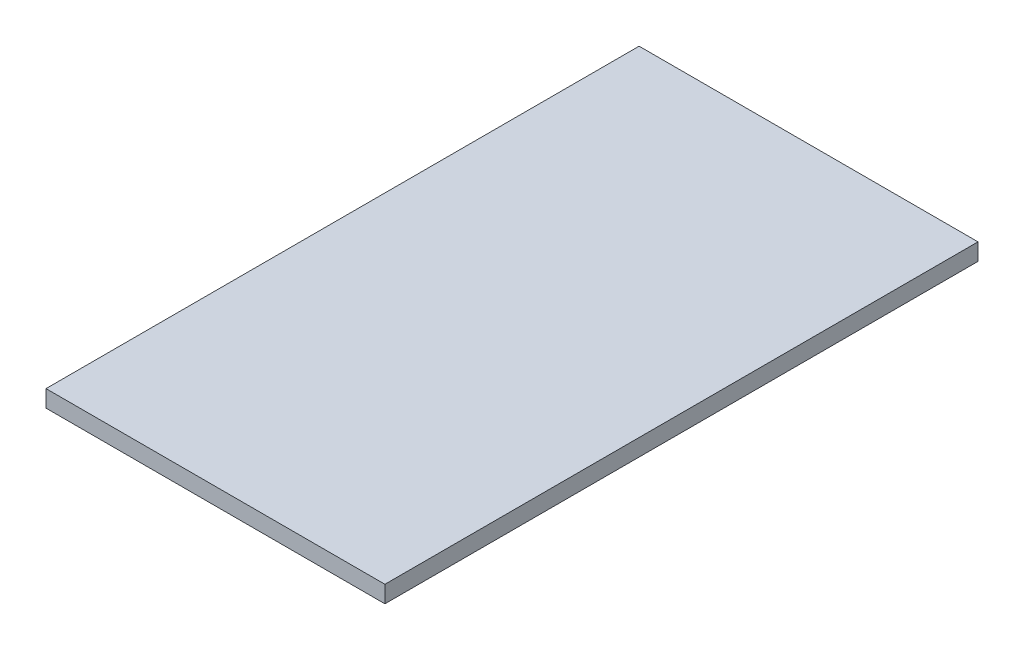
ISO-10303-21;
HEADER;
FILE_DESCRIPTION(('STEP AP214'),'2;1');
FILE_NAME('part.step','',(''),(''),'','','');
FILE_SCHEMA(('AUTOMOTIVE_DESIGN { 1 0 10303 214 1 1 1 1 }'));
ENDSEC;
DATA;
#1=APPLICATION_CONTEXT('core data for automotive mechanical design processes');
#2=APPLICATION_PROTOCOL_DEFINITION('international standard','automotive_design',2000,#1);
#3=PRODUCT_CONTEXT('',#1,'mechanical');
#4=PRODUCT('Part','Part','',(#3));
#5=PRODUCT_RELATED_PRODUCT_CATEGORY('part','',(#4));
#6=PRODUCT_DEFINITION_FORMATION('','',#4);
#7=PRODUCT_DEFINITION_CONTEXT('part definition',#1,'design');
#8=PRODUCT_DEFINITION('design','',#6,#7);
#9=PRODUCT_DEFINITION_SHAPE('','',#8);
#10=(LENGTH_UNIT() NAMED_UNIT(*) SI_UNIT(.MILLI.,.METRE.));
#11=(NAMED_UNIT(*) PLANE_ANGLE_UNIT() SI_UNIT($,.RADIAN.));
#12=(NAMED_UNIT(*) SI_UNIT($,.STERADIAN.) SOLID_ANGLE_UNIT());
#13=UNCERTAINTY_MEASURE_WITH_UNIT(LENGTH_MEASURE(1.E-05),#10,'distance_accuracy_value','');
#14=(GEOMETRIC_REPRESENTATION_CONTEXT(3) GLOBAL_UNCERTAINTY_ASSIGNED_CONTEXT((#13)) GLOBAL_UNIT_ASSIGNED_CONTEXT((#10,
#11,#12)) REPRESENTATION_CONTEXT('',''));
#15=CARTESIAN_POINT('',(0.,0.,0.));
#16=DIRECTION('',(0.,0.,1.));
#17=DIRECTION('',(1.,0.,0.));
#18=AXIS2_PLACEMENT_3D('',#15,#16,#17);
#19=CARTESIAN_POINT('',(0.,10.,0.));
#20=DIRECTION('',(1.,0.,0.));
#21=DIRECTION('',(0.,0.,-1.));
#22=AXIS2_PLACEMENT_3D('',#19,#20,#21);
#23=PLANE('',#22);
#24=DIRECTION('',(0.,0.,1.));
#25=VECTOR('',#24,1.);
#26=CARTESIAN_POINT('',(0.,0.,0.));
#27=LINE('',#26,#25);
#28=CARTESIAN_POINT('',(0.,0.,-350.));
#29=VERTEX_POINT('',#28);
#30=CARTESIAN_POINT('',(0.,0.,0.));
#31=VERTEX_POINT('',#30);
#32=EDGE_CURVE('E98',#29,#31,#27,.T.);
#33=ORIENTED_EDGE('',*,*,#32,.T.);
#34=DIRECTION('',(0.,-1.,0.));
#35=VECTOR('',#34,1.);
#36=CARTESIAN_POINT('',(0.,10.,0.));
#37=LINE('',#36,#35);
#38=CARTESIAN_POINT('',(0.,10.,0.));
#39=VERTEX_POINT('',#38);
#40=EDGE_CURVE('E11',#39,#31,#37,.T.);
#41=ORIENTED_EDGE('',*,*,#40,.F.);
#42=DIRECTION('',(0.,0.,1.));
#43=VECTOR('',#42,1.);
#44=CARTESIAN_POINT('',(0.,10.,0.));
#45=LINE('',#44,#43);
#46=CARTESIAN_POINT('',(0.,10.,-350.));
#47=VERTEX_POINT('',#46);
#48=EDGE_CURVE('E86',#47,#39,#45,.T.);
#49=ORIENTED_EDGE('',*,*,#48,.F.);
#50=DIRECTION('',(0.,-1.,0.));
#51=VECTOR('',#50,1.);
#52=CARTESIAN_POINT('',(0.,10.,-350.));
#53=LINE('',#52,#51);
#54=EDGE_CURVE('E94',#47,#29,#53,.T.);
#55=ORIENTED_EDGE('',*,*,#54,.T.);
#56=EDGE_LOOP('',(#33,#41,#49,#55));
#57=FACE_BOUND('',#56,.T.);
#58=ADVANCED_FACE('F35',(#57),#23,.F.);
#59=CARTESIAN_POINT('',(0.,10.,0.));
#60=DIRECTION('',(0.,0.,-1.));
#61=DIRECTION('',(-1.,0.,0.));
#62=AXIS2_PLACEMENT_3D('',#59,#60,#61);
#63=PLANE('',#62);
#64=DIRECTION('',(1.,0.,0.));
#65=VECTOR('',#64,1.);
#66=CARTESIAN_POINT('',(0.,0.,0.));
#67=LINE('',#66,#65);
#68=CARTESIAN_POINT('',(200.,0.,0.));
#69=VERTEX_POINT('',#68);
#70=EDGE_CURVE('E90',#31,#69,#67,.T.);
#71=ORIENTED_EDGE('',*,*,#70,.T.);
#72=DIRECTION('',(0.,-1.,0.));
#73=VECTOR('',#72,1.);
#74=CARTESIAN_POINT('',(200.,10.,0.));
#75=LINE('',#74,#73);
#76=CARTESIAN_POINT('',(200.,10.,0.));
#77=VERTEX_POINT('',#76);
#78=EDGE_CURVE('E43',#77,#69,#75,.T.);
#79=ORIENTED_EDGE('',*,*,#78,.F.);
#80=DIRECTION('',(1.,0.,0.));
#81=VECTOR('',#80,1.);
#82=CARTESIAN_POINT('',(0.,10.,0.));
#83=LINE('',#82,#81);
#84=EDGE_CURVE('E81',#39,#77,#83,.T.);
#85=ORIENTED_EDGE('',*,*,#84,.F.);
#86=ORIENTED_EDGE('',*,*,#40,.T.);
#87=EDGE_LOOP('',(#71,#79,#85,#86));
#88=FACE_BOUND('',#87,.T.);
#89=ADVANCED_FACE('F89',(#88),#63,.F.);
#90=CARTESIAN_POINT('',(200.,10.,0.));
#91=DIRECTION('',(-1.,0.,0.));
#92=DIRECTION('',(0.,0.,1.));
#93=AXIS2_PLACEMENT_3D('',#90,#91,#92);
#94=PLANE('',#93);
#95=DIRECTION('',(0.,0.,-1.));
#96=VECTOR('',#95,1.);
#97=CARTESIAN_POINT('',(200.,0.,0.));
#98=LINE('',#97,#96);
#99=CARTESIAN_POINT('',(200.,0.,-350.));
#100=VERTEX_POINT('',#99);
#101=EDGE_CURVE('E68',#69,#100,#98,.T.);
#102=ORIENTED_EDGE('',*,*,#101,.T.);
#103=DIRECTION('',(0.,-1.,0.));
#104=VECTOR('',#103,1.);
#105=CARTESIAN_POINT('',(200.,10.,-350.));
#106=LINE('',#105,#104);
#107=CARTESIAN_POINT('',(200.,10.,-350.));
#108=VERTEX_POINT('',#107);
#109=EDGE_CURVE('E91',#108,#100,#106,.T.);
#110=ORIENTED_EDGE('',*,*,#109,.F.);
#111=DIRECTION('',(0.,0.,-1.));
#112=VECTOR('',#111,1.);
#113=CARTESIAN_POINT('',(200.,10.,0.));
#114=LINE('',#113,#112);
#115=EDGE_CURVE('E84',#77,#108,#114,.T.);
#116=ORIENTED_EDGE('',*,*,#115,.F.);
#117=ORIENTED_EDGE('',*,*,#78,.T.);
#118=EDGE_LOOP('',(#102,#110,#116,#117));
#119=FACE_BOUND('',#118,.T.);
#120=ADVANCED_FACE('F92',(#119),#94,.F.);
#121=CARTESIAN_POINT('',(0.,10.,-350.));
#122=DIRECTION('',(0.,0.,1.));
#123=DIRECTION('',(1.,0.,0.));
#124=AXIS2_PLACEMENT_3D('',#121,#122,#123);
#125=PLANE('',#124);
#126=DIRECTION('',(-1.,0.,0.));
#127=VECTOR('',#126,1.);
#128=CARTESIAN_POINT('',(0.,0.,-350.));
#129=LINE('',#128,#127);
#130=EDGE_CURVE('E74',#100,#29,#129,.T.);
#131=ORIENTED_EDGE('',*,*,#130,.T.);
#132=ORIENTED_EDGE('',*,*,#54,.F.);
#133=DIRECTION('',(-1.,0.,0.));
#134=VECTOR('',#133,1.);
#135=CARTESIAN_POINT('',(0.,10.,-350.));
#136=LINE('',#135,#134);
#137=EDGE_CURVE('E51',#108,#47,#136,.T.);
#138=ORIENTED_EDGE('',*,*,#137,.F.);
#139=ORIENTED_EDGE('',*,*,#109,.T.);
#140=EDGE_LOOP('',(#131,#132,#138,#139));
#141=FACE_BOUND('',#140,.T.);
#142=ADVANCED_FACE('F105',(#141),#125,.F.);
#143=CARTESIAN_POINT('',(0.,10.,0.));
#144=DIRECTION('',(0.,-1.,0.));
#145=DIRECTION('',(0.,0.,-1.));
#146=AXIS2_PLACEMENT_3D('',#143,#144,#145);
#147=PLANE('',#146);
#148=ORIENTED_EDGE('',*,*,#48,.T.);
#149=ORIENTED_EDGE('',*,*,#84,.T.);
#150=ORIENTED_EDGE('',*,*,#115,.T.);
#151=ORIENTED_EDGE('',*,*,#137,.T.);
#152=EDGE_LOOP('',(#148,#149,#150,#151));
#153=FACE_BOUND('',#152,.T.);
#154=ADVANCED_FACE('F82',(#153),#147,.F.);
#155=CARTESIAN_POINT('',(0.,0.,0.));
#156=DIRECTION('',(0.,-1.,0.));
#157=DIRECTION('',(0.,0.,-1.));
#158=AXIS2_PLACEMENT_3D('',#155,#156,#157);
#159=PLANE('',#158);
#160=ORIENTED_EDGE('',*,*,#32,.F.);
#161=ORIENTED_EDGE('',*,*,#130,.F.);
#162=ORIENTED_EDGE('',*,*,#101,.F.);
#163=ORIENTED_EDGE('',*,*,#70,.F.);
#164=EDGE_LOOP('',(#160,#161,#162,#163));
#165=FACE_BOUND('',#164,.T.);
#166=ADVANCED_FACE('F108',(#165),#159,.T.);
#167=CLOSED_SHELL('',(#58,#89,#120,#142,#154,#166));
#168=MANIFOLD_SOLID_BREP('B2',#167);
#169=ADVANCED_BREP_SHAPE_REPRESENTATION('',(#18,#168),#14);
#170=SHAPE_DEFINITION_REPRESENTATION(#9,#169);
ENDSEC;
END-ISO-10303-21;
